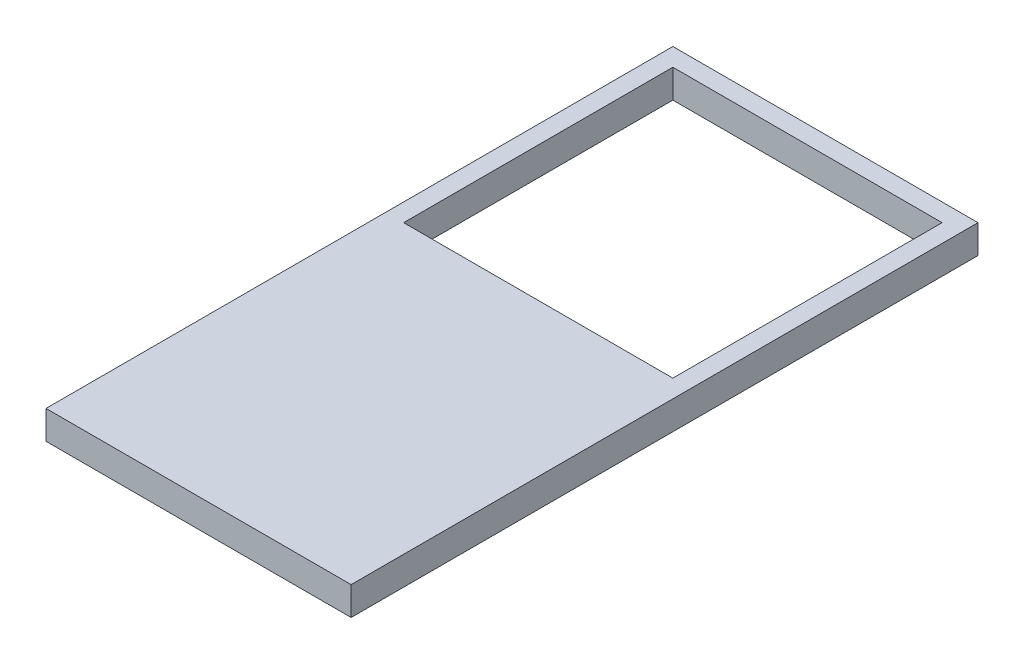
ISO-10303-21;
HEADER;
FILE_DESCRIPTION(('STEP AP214'),'2;1');
FILE_NAME('part.step','',(''),(''),'','','');
FILE_SCHEMA(('AUTOMOTIVE_DESIGN { 1 0 10303 214 1 1 1 1 }'));
ENDSEC;
DATA;
#1=APPLICATION_CONTEXT('core data for automotive mechanical design processes');
#2=APPLICATION_PROTOCOL_DEFINITION('international standard','automotive_design',2000,#1);
#3=PRODUCT_CONTEXT('',#1,'mechanical');
#4=PRODUCT('Part','Part','',(#3));
#5=PRODUCT_RELATED_PRODUCT_CATEGORY('part','',(#4));
#6=PRODUCT_DEFINITION_FORMATION('','',#4);
#7=PRODUCT_DEFINITION_CONTEXT('part definition',#1,'design');
#8=PRODUCT_DEFINITION('design','',#6,#7);
#9=PRODUCT_DEFINITION_SHAPE('','',#8);
#10=(LENGTH_UNIT() NAMED_UNIT(*) SI_UNIT(.MILLI.,.METRE.));
#11=(NAMED_UNIT(*) PLANE_ANGLE_UNIT() SI_UNIT($,.RADIAN.));
#12=(NAMED_UNIT(*) SI_UNIT($,.STERADIAN.) SOLID_ANGLE_UNIT());
#13=UNCERTAINTY_MEASURE_WITH_UNIT(LENGTH_MEASURE(1.E-05),#10,'distance_accuracy_value','');
#14=(GEOMETRIC_REPRESENTATION_CONTEXT(3) GLOBAL_UNCERTAINTY_ASSIGNED_CONTEXT((#13)) GLOBAL_UNIT_ASSIGNED_CONTEXT((#10,
#11,#12)) REPRESENTATION_CONTEXT('',''));
#15=CARTESIAN_POINT('',(0.,0.,0.));
#16=DIRECTION('',(0.,0.,1.));
#17=DIRECTION('',(1.,0.,0.));
#18=AXIS2_PLACEMENT_3D('',#15,#16,#17);
#19=CARTESIAN_POINT('',(0.,0.,34.925));
#20=DIRECTION('',(-1.,0.,0.));
#21=DIRECTION('',(0.,0.,1.));
#22=AXIS2_PLACEMENT_3D('',#19,#20,#21);
#23=PLANE('',#22);
#24=DIRECTION('',(0.,1.,0.));
#25=VECTOR('',#24,1.);
#26=CARTESIAN_POINT('',(0.,0.,0.));
#27=LINE('',#26,#25);
#28=CARTESIAN_POINT('',(0.,0.,0.));
#29=VERTEX_POINT('',#28);
#30=CARTESIAN_POINT('',(0.,1.5875,0.));
#31=VERTEX_POINT('',#30);
#32=EDGE_CURVE('E131',#29,#31,#27,.T.);
#33=ORIENTED_EDGE('',*,*,#32,.F.);
#34=DIRECTION('',(0.,0.,-1.));
#35=VECTOR('',#34,1.);
#36=CARTESIAN_POINT('',(0.,0.,34.925));
#37=LINE('',#36,#35);
#38=CARTESIAN_POINT('',(0.,0.,34.925));
#39=VERTEX_POINT('',#38);
#40=EDGE_CURVE('E11',#39,#29,#37,.T.);
#41=ORIENTED_EDGE('',*,*,#40,.F.);
#42=DIRECTION('',(0.,1.,0.));
#43=VECTOR('',#42,1.);
#44=CARTESIAN_POINT('',(0.,0.,34.925));
#45=LINE('',#44,#43);
#46=CARTESIAN_POINT('',(0.,1.5875,34.925));
#47=VERTEX_POINT('',#46);
#48=EDGE_CURVE('E135',#39,#47,#45,.T.);
#49=ORIENTED_EDGE('',*,*,#48,.T.);
#50=DIRECTION('',(0.,0.,-1.));
#51=VECTOR('',#50,1.);
#52=CARTESIAN_POINT('',(0.,1.5875,34.925));
#53=LINE('',#52,#51);
#54=EDGE_CURVE('E36',#47,#31,#53,.T.);
#55=ORIENTED_EDGE('',*,*,#54,.T.);
#56=EDGE_LOOP('',(#33,#41,#49,#55));
#57=FACE_BOUND('',#56,.T.);
#58=ADVANCED_FACE('F33',(#57),#23,.T.);
#59=CARTESIAN_POINT('',(0.,0.,34.925));
#60=DIRECTION('',(0.,1.,0.));
#61=DIRECTION('',(0.,0.,1.));
#62=AXIS2_PLACEMENT_3D('',#59,#60,#61);
#63=PLANE('',#62);
#64=DIRECTION('',(1.,0.,0.));
#65=VECTOR('',#64,1.);
#66=CARTESIAN_POINT('',(1.,0.,16.));
#67=LINE('',#66,#65);
#68=CARTESIAN_POINT('',(1.,0.,16.));
#69=VERTEX_POINT('',#68);
#70=CARTESIAN_POINT('',(16.,0.,16.));
#71=VERTEX_POINT('',#70);
#72=EDGE_CURVE('E106',#69,#71,#67,.T.);
#73=ORIENTED_EDGE('',*,*,#72,.T.);
#74=DIRECTION('',(0.,0.,-1.));
#75=VECTOR('',#74,1.);
#76=CARTESIAN_POINT('',(16.,0.,1.));
#77=LINE('',#76,#75);
#78=CARTESIAN_POINT('',(16.,0.,1.));
#79=VERTEX_POINT('',#78);
#80=EDGE_CURVE('E100',#71,#79,#77,.T.);
#81=ORIENTED_EDGE('',*,*,#80,.T.);
#82=DIRECTION('',(-1.,0.,0.));
#83=VECTOR('',#82,1.);
#84=CARTESIAN_POINT('',(1.,0.,1.));
#85=LINE('',#84,#83);
#86=CARTESIAN_POINT('',(1.,0.,1.));
#87=VERTEX_POINT('',#86);
#88=EDGE_CURVE('E109',#79,#87,#85,.T.);
#89=ORIENTED_EDGE('',*,*,#88,.T.);
#90=DIRECTION('',(0.,0.,1.));
#91=VECTOR('',#90,1.);
#92=CARTESIAN_POINT('',(1.,0.,1.));
#93=LINE('',#92,#91);
#94=EDGE_CURVE('E49',#87,#69,#93,.T.);
#95=ORIENTED_EDGE('',*,*,#94,.T.);
#96=EDGE_LOOP('',(#73,#81,#89,#95));
#97=FACE_BOUND('',#96,.T.);
#98=DIRECTION('',(1.,0.,0.));
#99=VECTOR('',#98,1.);
#100=CARTESIAN_POINT('',(0.,0.,0.));
#101=LINE('',#100,#99);
#102=CARTESIAN_POINT('',(17.,0.,0.));
#103=VERTEX_POINT('',#102);
#104=EDGE_CURVE('E139',#29,#103,#101,.T.);
#105=ORIENTED_EDGE('',*,*,#104,.T.);
#106=DIRECTION('',(0.,0.,-1.));
#107=VECTOR('',#106,1.);
#108=CARTESIAN_POINT('',(17.,0.,34.925));
#109=LINE('',#108,#107);
#110=CARTESIAN_POINT('',(17.,0.,34.925));
#111=VERTEX_POINT('',#110);
#112=EDGE_CURVE('E41',#111,#103,#109,.T.);
#113=ORIENTED_EDGE('',*,*,#112,.F.);
#114=DIRECTION('',(1.,0.,0.));
#115=VECTOR('',#114,1.);
#116=CARTESIAN_POINT('',(0.,0.,34.925));
#117=LINE('',#116,#115);
#118=EDGE_CURVE('E144',#39,#111,#117,.T.);
#119=ORIENTED_EDGE('',*,*,#118,.F.);
#120=ORIENTED_EDGE('',*,*,#40,.T.);
#121=EDGE_LOOP('',(#105,#113,#119,#120));
#122=FACE_BOUND('',#121,.T.);
#123=ADVANCED_FACE('F113',(#97,#122),#63,.F.);
#124=CARTESIAN_POINT('',(17.,0.,34.925));
#125=DIRECTION('',(-1.,0.,0.));
#126=DIRECTION('',(0.,0.,1.));
#127=AXIS2_PLACEMENT_3D('',#124,#125,#126);
#128=PLANE('',#127);
#129=DIRECTION('',(0.,1.,0.));
#130=VECTOR('',#129,1.);
#131=CARTESIAN_POINT('',(17.,0.,0.));
#132=LINE('',#131,#130);
#133=CARTESIAN_POINT('',(17.,1.5875,0.));
#134=VERTEX_POINT('',#133);
#135=EDGE_CURVE('E151',#103,#134,#132,.T.);
#136=ORIENTED_EDGE('',*,*,#135,.T.);
#137=DIRECTION('',(0.,0.,-1.));
#138=VECTOR('',#137,1.);
#139=CARTESIAN_POINT('',(17.,1.5875,34.925));
#140=LINE('',#139,#138);
#141=CARTESIAN_POINT('',(17.,1.5875,34.925));
#142=VERTEX_POINT('',#141);
#143=EDGE_CURVE('E156',#142,#134,#140,.T.);
#144=ORIENTED_EDGE('',*,*,#143,.F.);
#145=DIRECTION('',(0.,1.,0.));
#146=VECTOR('',#145,1.);
#147=CARTESIAN_POINT('',(17.,0.,34.925));
#148=LINE('',#147,#146);
#149=EDGE_CURVE('E142',#111,#142,#148,.T.);
#150=ORIENTED_EDGE('',*,*,#149,.F.);
#151=ORIENTED_EDGE('',*,*,#112,.T.);
#152=EDGE_LOOP('',(#136,#144,#150,#151));
#153=FACE_BOUND('',#152,.T.);
#154=ADVANCED_FACE('F173',(#153),#128,.F.);
#155=CARTESIAN_POINT('',(0.,1.5875,34.925));
#156=DIRECTION('',(0.,1.,0.));
#157=DIRECTION('',(0.,0.,1.));
#158=AXIS2_PLACEMENT_3D('',#155,#156,#157);
#159=PLANE('',#158);
#160=DIRECTION('',(0.,0.,-1.));
#161=VECTOR('',#160,1.);
#162=CARTESIAN_POINT('',(16.,1.5875,1.));
#163=LINE('',#162,#161);
#164=CARTESIAN_POINT('',(16.,1.5875,16.));
#165=VERTEX_POINT('',#164);
#166=CARTESIAN_POINT('',(16.,1.5875,1.));
#167=VERTEX_POINT('',#166);
#168=EDGE_CURVE('E57',#165,#167,#163,.T.);
#169=ORIENTED_EDGE('',*,*,#168,.F.);
#170=DIRECTION('',(1.,0.,0.));
#171=VECTOR('',#170,1.);
#172=CARTESIAN_POINT('',(1.,1.5875,16.));
#173=LINE('',#172,#171);
#174=CARTESIAN_POINT('',(1.,1.5875,16.));
#175=VERTEX_POINT('',#174);
#176=EDGE_CURVE('E116',#175,#165,#173,.T.);
#177=ORIENTED_EDGE('',*,*,#176,.F.);
#178=DIRECTION('',(0.,0.,1.));
#179=VECTOR('',#178,1.);
#180=CARTESIAN_POINT('',(1.,1.5875,1.));
#181=LINE('',#180,#179);
#182=CARTESIAN_POINT('',(1.,1.5875,1.));
#183=VERTEX_POINT('',#182);
#184=EDGE_CURVE('E119',#183,#175,#181,.T.);
#185=ORIENTED_EDGE('',*,*,#184,.F.);
#186=DIRECTION('',(-1.,0.,0.));
#187=VECTOR('',#186,1.);
#188=CARTESIAN_POINT('',(1.,1.5875,1.));
#189=LINE('',#188,#187);
#190=EDGE_CURVE('E125',#167,#183,#189,.T.);
#191=ORIENTED_EDGE('',*,*,#190,.F.);
#192=EDGE_LOOP('',(#169,#177,#185,#191));
#193=FACE_BOUND('',#192,.T.);
#194=DIRECTION('',(1.,0.,0.));
#195=VECTOR('',#194,1.);
#196=CARTESIAN_POINT('',(0.,1.5875,0.));
#197=LINE('',#196,#195);
#198=EDGE_CURVE('E148',#31,#134,#197,.T.);
#199=ORIENTED_EDGE('',*,*,#198,.F.);
#200=ORIENTED_EDGE('',*,*,#54,.F.);
#201=DIRECTION('',(1.,0.,0.));
#202=VECTOR('',#201,1.);
#203=CARTESIAN_POINT('',(0.,1.5875,34.925));
#204=LINE('',#203,#202);
#205=EDGE_CURVE('E138',#47,#142,#204,.T.);
#206=ORIENTED_EDGE('',*,*,#205,.T.);
#207=ORIENTED_EDGE('',*,*,#143,.T.);
#208=EDGE_LOOP('',(#199,#200,#206,#207));
#209=FACE_BOUND('',#208,.T.);
#210=ADVANCED_FACE('F164',(#193,#209),#159,.T.);
#211=CARTESIAN_POINT('',(0.,0.,34.925));
#212=DIRECTION('',(0.,0.,-1.));
#213=DIRECTION('',(-1.,0.,0.));
#214=AXIS2_PLACEMENT_3D('',#211,#212,#213);
#215=PLANE('',#214);
#216=ORIENTED_EDGE('',*,*,#48,.F.);
#217=ORIENTED_EDGE('',*,*,#118,.T.);
#218=ORIENTED_EDGE('',*,*,#149,.T.);
#219=ORIENTED_EDGE('',*,*,#205,.F.);
#220=EDGE_LOOP('',(#216,#217,#218,#219));
#221=FACE_BOUND('',#220,.T.);
#222=ADVANCED_FACE('F175',(#221),#215,.F.);
#223=CARTESIAN_POINT('',(0.,0.,0.));
#224=DIRECTION('',(0.,0.,-1.));
#225=DIRECTION('',(-1.,0.,0.));
#226=AXIS2_PLACEMENT_3D('',#223,#224,#225);
#227=PLANE('',#226);
#228=ORIENTED_EDGE('',*,*,#32,.T.);
#229=ORIENTED_EDGE('',*,*,#198,.T.);
#230=ORIENTED_EDGE('',*,*,#135,.F.);
#231=ORIENTED_EDGE('',*,*,#104,.F.);
#232=EDGE_LOOP('',(#228,#229,#230,#231));
#233=FACE_BOUND('',#232,.T.);
#234=ADVANCED_FACE('F168',(#233),#227,.T.);
#235=CARTESIAN_POINT('',(16.,0.,1.));
#236=DIRECTION('',(1.,0.,0.));
#237=DIRECTION('',(0.,0.,-1.));
#238=AXIS2_PLACEMENT_3D('',#235,#236,#237);
#239=PLANE('',#238);
#240=ORIENTED_EDGE('',*,*,#168,.T.);
#241=DIRECTION('',(0.,1.,0.));
#242=VECTOR('',#241,1.);
#243=CARTESIAN_POINT('',(16.,0.,1.));
#244=LINE('',#243,#242);
#245=EDGE_CURVE('E96',#79,#167,#244,.T.);
#246=ORIENTED_EDGE('',*,*,#245,.F.);
#247=ORIENTED_EDGE('',*,*,#80,.F.);
#248=DIRECTION('',(0.,1.,0.));
#249=VECTOR('',#248,1.);
#250=CARTESIAN_POINT('',(16.,0.,16.));
#251=LINE('',#250,#249);
#252=EDGE_CURVE('E129',#71,#165,#251,.T.);
#253=ORIENTED_EDGE('',*,*,#252,.T.);
#254=EDGE_LOOP('',(#240,#246,#247,#253));
#255=FACE_BOUND('',#254,.T.);
#256=ADVANCED_FACE('F98',(#255),#239,.F.);
#257=CARTESIAN_POINT('',(1.,0.,16.));
#258=DIRECTION('',(0.,0.,1.));
#259=DIRECTION('',(1.,0.,0.));
#260=AXIS2_PLACEMENT_3D('',#257,#258,#259);
#261=PLANE('',#260);
#262=ORIENTED_EDGE('',*,*,#176,.T.);
#263=ORIENTED_EDGE('',*,*,#252,.F.);
#264=ORIENTED_EDGE('',*,*,#72,.F.);
#265=DIRECTION('',(0.,1.,0.));
#266=VECTOR('',#265,1.);
#267=CARTESIAN_POINT('',(1.,0.,16.));
#268=LINE('',#267,#266);
#269=EDGE_CURVE('E132',#69,#175,#268,.T.);
#270=ORIENTED_EDGE('',*,*,#269,.T.);
#271=EDGE_LOOP('',(#262,#263,#264,#270));
#272=FACE_BOUND('',#271,.T.);
#273=ADVANCED_FACE('F213',(#272),#261,.F.);
#274=CARTESIAN_POINT('',(1.,0.,1.));
#275=DIRECTION('',(-1.,0.,0.));
#276=DIRECTION('',(0.,0.,1.));
#277=AXIS2_PLACEMENT_3D('',#274,#275,#276);
#278=PLANE('',#277);
#279=ORIENTED_EDGE('',*,*,#184,.T.);
#280=ORIENTED_EDGE('',*,*,#269,.F.);
#281=ORIENTED_EDGE('',*,*,#94,.F.);
#282=DIRECTION('',(0.,1.,0.));
#283=VECTOR('',#282,1.);
#284=CARTESIAN_POINT('',(1.,0.,1.));
#285=LINE('',#284,#283);
#286=EDGE_CURVE('E105',#87,#183,#285,.T.);
#287=ORIENTED_EDGE('',*,*,#286,.T.);
#288=EDGE_LOOP('',(#279,#280,#281,#287));
#289=FACE_BOUND('',#288,.T.);
#290=ADVANCED_FACE('F222',(#289),#278,.F.);
#291=CARTESIAN_POINT('',(1.,0.,1.));
#292=DIRECTION('',(0.,0.,-1.));
#293=DIRECTION('',(-1.,0.,0.));
#294=AXIS2_PLACEMENT_3D('',#291,#292,#293);
#295=PLANE('',#294);
#296=ORIENTED_EDGE('',*,*,#190,.T.);
#297=ORIENTED_EDGE('',*,*,#286,.F.);
#298=ORIENTED_EDGE('',*,*,#88,.F.);
#299=ORIENTED_EDGE('',*,*,#245,.T.);
#300=EDGE_LOOP('',(#296,#297,#298,#299));
#301=FACE_BOUND('',#300,.T.);
#302=ADVANCED_FACE('F110',(#301),#295,.F.);
#303=CLOSED_SHELL('',(#58,#123,#154,#210,#222,#234,#256,#273,#290,#302));
#304=MANIFOLD_SOLID_BREP('B2',#303);
#305=ADVANCED_BREP_SHAPE_REPRESENTATION('',(#18,#304),#14);
#306=SHAPE_DEFINITION_REPRESENTATION(#9,#305);
ENDSEC;
END-ISO-10303-21;
